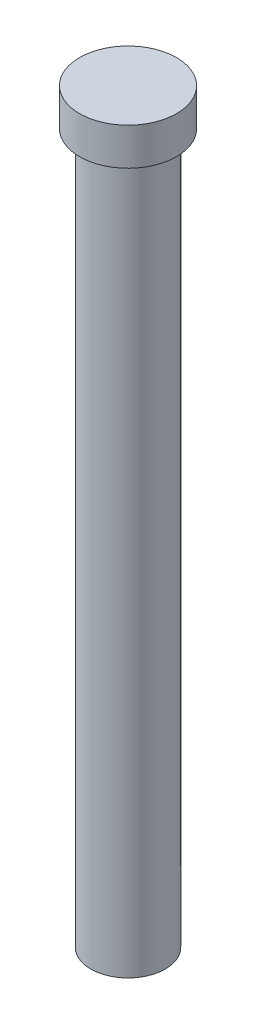
ISO-10303-21;
HEADER;
FILE_DESCRIPTION(('STEP AP214'),'2;1');
FILE_NAME('part.step','',(''),(''),'','','');
FILE_SCHEMA(('AUTOMOTIVE_DESIGN { 1 0 10303 214 1 1 1 1 }'));
ENDSEC;
DATA;
#1=APPLICATION_CONTEXT('core data for automotive mechanical design processes');
#2=APPLICATION_PROTOCOL_DEFINITION('international standard','automotive_design',2000,#1);
#3=PRODUCT_CONTEXT('',#1,'mechanical');
#4=PRODUCT('Part','Part','',(#3));
#5=PRODUCT_RELATED_PRODUCT_CATEGORY('part','',(#4));
#6=PRODUCT_DEFINITION_FORMATION('','',#4);
#7=PRODUCT_DEFINITION_CONTEXT('part definition',#1,'design');
#8=PRODUCT_DEFINITION('design','',#6,#7);
#9=PRODUCT_DEFINITION_SHAPE('','',#8);
#10=(LENGTH_UNIT() NAMED_UNIT(*) SI_UNIT(.MILLI.,.METRE.));
#11=(NAMED_UNIT(*) PLANE_ANGLE_UNIT() SI_UNIT($,.RADIAN.));
#12=(NAMED_UNIT(*) SI_UNIT($,.STERADIAN.) SOLID_ANGLE_UNIT());
#13=UNCERTAINTY_MEASURE_WITH_UNIT(LENGTH_MEASURE(1.E-05),#10,'distance_accuracy_value','');
#14=(GEOMETRIC_REPRESENTATION_CONTEXT(3) GLOBAL_UNCERTAINTY_ASSIGNED_CONTEXT((#13)) GLOBAL_UNIT_ASSIGNED_CONTEXT((#10,
#11,#12)) REPRESENTATION_CONTEXT('',''));
#15=CARTESIAN_POINT('',(0.,0.,0.));
#16=DIRECTION('',(0.,0.,1.));
#17=DIRECTION('',(1.,0.,0.));
#18=AXIS2_PLACEMENT_3D('',#15,#16,#17);
#19=CARTESIAN_POINT('',(0.,0.,0.));
#20=DIRECTION('',(0.,1.,0.));
#21=DIRECTION('',(0.,0.,1.));
#22=AXIS2_PLACEMENT_3D('',#19,#20,#21);
#23=PLANE('',#22);
#24=CARTESIAN_POINT('',(0.,0.,0.));
#25=DIRECTION('',(0.,-1.,0.));
#26=DIRECTION('',(0.,0.,-1.));
#27=AXIS2_PLACEMENT_3D('',#24,#25,#26);
#28=CIRCLE('',#27,6.5);
#29=CARTESIAN_POINT('',(0.,0.,-6.5));
#30=VERTEX_POINT('',#29);
#31=EDGE_CURVE('E10',#30,#30,#28,.T.);
#32=ORIENTED_EDGE('',*,*,#31,.F.);
#33=EDGE_LOOP('',(#32));
#34=FACE_BOUND('',#33,.T.);
#35=ADVANCED_FACE('F39',(#34),#23,.T.);
#36=CARTESIAN_POINT('',(0.,-105.,0.));
#37=DIRECTION('',(0.,-1.,0.));
#38=DIRECTION('',(0.,0.,-1.));
#39=AXIS2_PLACEMENT_3D('',#36,#37,#38);
#40=CYLINDRICAL_SURFACE('',#39,6.5);
#41=ORIENTED_EDGE('',*,*,#31,.T.);
#42=EDGE_LOOP('',(#41));
#43=FACE_BOUND('',#42,.T.);
#44=CARTESIAN_POINT('',(0.,-5.,0.));
#45=DIRECTION('',(0.,-1.,0.));
#46=DIRECTION('',(0.,0.,-1.));
#47=AXIS2_PLACEMENT_3D('',#44,#45,#46);
#48=CIRCLE('',#47,6.5);
#49=CARTESIAN_POINT('',(0.,-5.,-6.5));
#50=VERTEX_POINT('',#49);
#51=EDGE_CURVE('E45',#50,#50,#48,.T.);
#52=ORIENTED_EDGE('',*,*,#51,.F.);
#53=EDGE_LOOP('',(#52));
#54=FACE_BOUND('',#53,.T.);
#55=ADVANCED_FACE('F71',(#43,#54),#40,.T.);
#56=CARTESIAN_POINT('',(5.,-5.,0.));
#57=DIRECTION('',(0.,-1.,0.));
#58=DIRECTION('',(0.,0.,-1.));
#59=AXIS2_PLACEMENT_3D('',#56,#57,#58);
#60=PLANE('',#59);
#61=ORIENTED_EDGE('',*,*,#51,.T.);
#62=EDGE_LOOP('',(#61));
#63=FACE_BOUND('',#62,.T.);
#64=CARTESIAN_POINT('',(0.,-5.,0.));
#65=DIRECTION('',(0.,-1.,0.));
#66=DIRECTION('',(0.,0.,-1.));
#67=AXIS2_PLACEMENT_3D('',#64,#65,#66);
#68=CIRCLE('',#67,5.);
#69=CARTESIAN_POINT('',(0.,-5.,-5.));
#70=VERTEX_POINT('',#69);
#71=EDGE_CURVE('E49',#70,#70,#68,.T.);
#72=ORIENTED_EDGE('',*,*,#71,.F.);
#73=EDGE_LOOP('',(#72));
#74=FACE_BOUND('',#73,.T.);
#75=ADVANCED_FACE('F63',(#63,#74),#60,.T.);
#76=CARTESIAN_POINT('',(0.,-105.,0.));
#77=DIRECTION('',(0.,-1.,0.));
#78=DIRECTION('',(0.,0.,-1.));
#79=AXIS2_PLACEMENT_3D('',#76,#77,#78);
#80=CYLINDRICAL_SURFACE('',#79,5.00000000000001);
#81=ORIENTED_EDGE('',*,*,#71,.T.);
#82=EDGE_LOOP('',(#81));
#83=FACE_BOUND('',#82,.T.);
#84=CARTESIAN_POINT('',(0.,-100.,0.));
#85=DIRECTION('',(0.,-1.,0.));
#86=DIRECTION('',(0.,0.,-1.));
#87=AXIS2_PLACEMENT_3D('',#84,#85,#86);
#88=CIRCLE('',#87,5.00000000000001);
#89=CARTESIAN_POINT('',(0.,-100.,-5.00000000000001));
#90=VERTEX_POINT('',#89);
#91=EDGE_CURVE('E53',#90,#90,#88,.T.);
#92=ORIENTED_EDGE('',*,*,#91,.F.);
#93=EDGE_LOOP('',(#92));
#94=FACE_BOUND('',#93,.T.);
#95=ADVANCED_FACE('F61',(#83,#94),#80,.T.);
#96=CARTESIAN_POINT('',(5.00000000000001,-100.,0.));
#97=DIRECTION('',(0.,-1.,0.));
#98=DIRECTION('',(0.,0.,-1.));
#99=AXIS2_PLACEMENT_3D('',#96,#97,#98);
#100=PLANE('',#99);
#101=ORIENTED_EDGE('',*,*,#91,.T.);
#102=EDGE_LOOP('',(#101));
#103=FACE_BOUND('',#102,.T.);
#104=ADVANCED_FACE('F59',(#103),#100,.T.);
#105=CLOSED_SHELL('',(#35,#55,#75,#95,#104));
#106=MANIFOLD_SOLID_BREP('B2',#105);
#107=ADVANCED_BREP_SHAPE_REPRESENTATION('',(#18,#106),#14);
#108=SHAPE_DEFINITION_REPRESENTATION(#9,#107);
ENDSEC;
END-ISO-10303-21;
